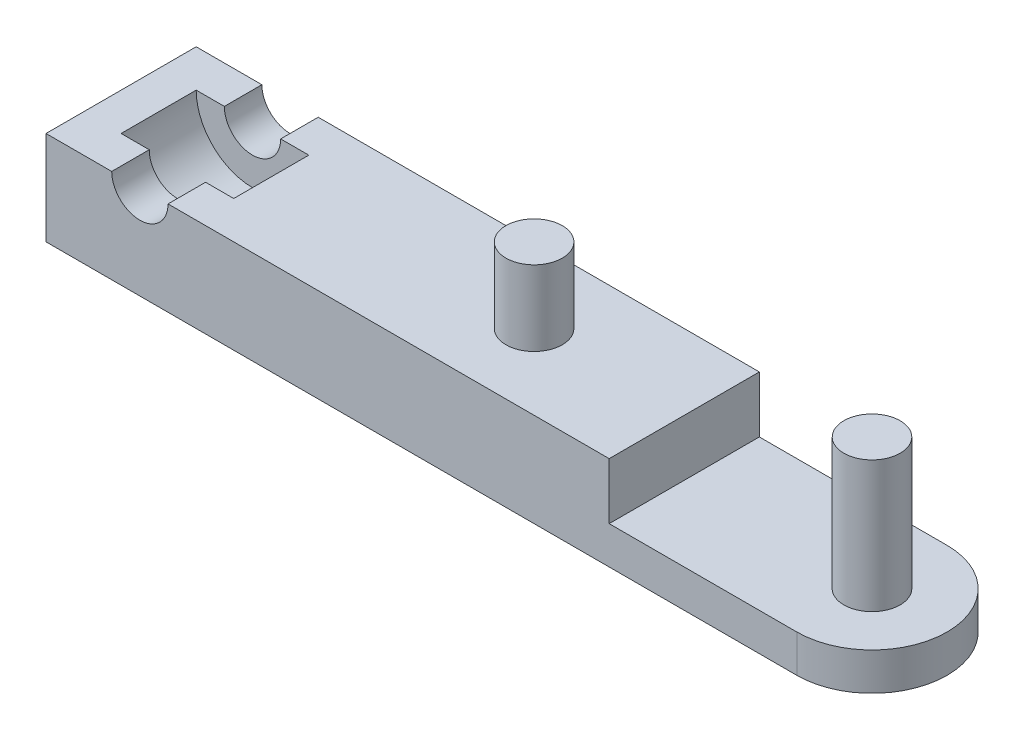
ISO-10303-21;
HEADER;
FILE_DESCRIPTION(('STEP AP214'),'2;1');
FILE_NAME('part.step','',(''),(''),'','','');
FILE_SCHEMA(('AUTOMOTIVE_DESIGN { 1 0 10303 214 1 1 1 1 }'));
ENDSEC;
DATA;
#1=APPLICATION_CONTEXT('core data for automotive mechanical design processes');
#2=APPLICATION_PROTOCOL_DEFINITION('international standard','automotive_design',2000,#1);
#3=PRODUCT_CONTEXT('',#1,'mechanical');
#4=PRODUCT('Part','Part','',(#3));
#5=PRODUCT_RELATED_PRODUCT_CATEGORY('part','',(#4));
#6=PRODUCT_DEFINITION_FORMATION('','',#4);
#7=PRODUCT_DEFINITION_CONTEXT('part definition',#1,'design');
#8=PRODUCT_DEFINITION('design','',#6,#7);
#9=PRODUCT_DEFINITION_SHAPE('','',#8);
#10=(LENGTH_UNIT() NAMED_UNIT(*) SI_UNIT(.MILLI.,.METRE.));
#11=(NAMED_UNIT(*) PLANE_ANGLE_UNIT() SI_UNIT($,.RADIAN.));
#12=(NAMED_UNIT(*) SI_UNIT($,.STERADIAN.) SOLID_ANGLE_UNIT());
#13=UNCERTAINTY_MEASURE_WITH_UNIT(LENGTH_MEASURE(1.E-05),#10,'distance_accuracy_value','');
#14=(GEOMETRIC_REPRESENTATION_CONTEXT(3) GLOBAL_UNCERTAINTY_ASSIGNED_CONTEXT((#13)) GLOBAL_UNIT_ASSIGNED_CONTEXT((#10,
#11,#12)) REPRESENTATION_CONTEXT('',''));
#15=CARTESIAN_POINT('',(0.,0.,0.));
#16=DIRECTION('',(0.,0.,1.));
#17=DIRECTION('',(1.,0.,0.));
#18=AXIS2_PLACEMENT_3D('',#15,#16,#17);
#19=CARTESIAN_POINT('',(30.,5.,-4.00004999999999));
#20=DIRECTION('',(0.,0.,1.));
#21=DIRECTION('',(1.,0.,0.));
#22=AXIS2_PLACEMENT_3D('',#19,#20,#21);
#23=CYLINDRICAL_SURFACE('',#22,1.5);
#24=CARTESIAN_POINT('',(30.,5.,-2.));
#25=DIRECTION('',(0.,0.,1.));
#26=DIRECTION('',(1.,0.,0.));
#27=AXIS2_PLACEMENT_3D('',#24,#25,#26);
#28=CIRCLE('',#27,1.5);
#29=CARTESIAN_POINT('',(31.5,5.,-2.));
#30=VERTEX_POINT('',#29);
#31=CARTESIAN_POINT('',(28.5,5.,-2.));
#32=VERTEX_POINT('',#31);
#33=EDGE_CURVE('E43',#30,#32,#28,.F.);
#34=ORIENTED_EDGE('',*,*,#33,.F.);
#35=DIRECTION('',(0.,0.,1.));
#36=VECTOR('',#35,1.);
#37=CARTESIAN_POINT('',(31.5,5.,-4.00004999999999));
#38=LINE('',#37,#36);
#39=CARTESIAN_POINT('',(31.5,5.,-3.99999999999999));
#40=VERTEX_POINT('',#39);
#41=EDGE_CURVE('E57',#40,#30,#38,.T.);
#42=ORIENTED_EDGE('',*,*,#41,.F.);
#43=CARTESIAN_POINT('',(30.,5.,-4.));
#44=DIRECTION('',(0.,0.,1.));
#45=DIRECTION('',(1.,0.,0.));
#46=AXIS2_PLACEMENT_3D('',#43,#44,#45);
#47=CIRCLE('',#46,1.5);
#48=CARTESIAN_POINT('',(28.5,5.,-4.));
#49=VERTEX_POINT('',#48);
#50=EDGE_CURVE('E206',#49,#40,#47,.T.);
#51=ORIENTED_EDGE('',*,*,#50,.F.);
#52=DIRECTION('',(0.,0.,1.));
#53=VECTOR('',#52,1.);
#54=CARTESIAN_POINT('',(28.5,5.,-4.00004999999999));
#55=LINE('',#54,#53);
#56=EDGE_CURVE('E154',#49,#32,#55,.T.);
#57=ORIENTED_EDGE('',*,*,#56,.T.);
#58=EDGE_LOOP('',(#34,#42,#51,#57));
#59=FACE_BOUND('',#58,.T.);
#60=ADVANCED_FACE('F35',(#59),#23,.F.);
#61=CARTESIAN_POINT('',(0.,5.,0.));
#62=DIRECTION('',(0.,1.,0.));
#63=DIRECTION('',(0.,0.,1.));
#64=AXIS2_PLACEMENT_3D('',#61,#62,#63);
#65=PLANE('',#64);
#66=DIRECTION('',(-1.,0.,0.));
#67=VECTOR('',#66,1.);
#68=CARTESIAN_POINT('',(27.,5.,2.));
#69=LINE('',#68,#67);
#70=CARTESIAN_POINT('',(28.5,5.,2.));
#71=VERTEX_POINT('',#70);
#72=CARTESIAN_POINT('',(27.,5.,2.));
#73=VERTEX_POINT('',#72);
#74=EDGE_CURVE('E145',#71,#73,#69,.T.);
#75=ORIENTED_EDGE('',*,*,#74,.T.);
#76=DIRECTION('',(0.,0.,-1.));
#77=VECTOR('',#76,1.);
#78=CARTESIAN_POINT('',(27.,5.,2.));
#79=LINE('',#78,#77);
#80=CARTESIAN_POINT('',(27.,5.,-2.));
#81=VERTEX_POINT('',#80);
#82=EDGE_CURVE('E135',#73,#81,#79,.T.);
#83=ORIENTED_EDGE('',*,*,#82,.T.);
#84=DIRECTION('',(-1.,0.,0.));
#85=VECTOR('',#84,1.);
#86=CARTESIAN_POINT('',(27.,5.,-2.));
#87=LINE('',#86,#85);
#88=EDGE_CURVE('E139',#32,#81,#87,.T.);
#89=ORIENTED_EDGE('',*,*,#88,.F.);
#90=ORIENTED_EDGE('',*,*,#56,.F.);
#91=DIRECTION('',(-1.,0.,0.));
#92=VECTOR('',#91,1.);
#93=CARTESIAN_POINT('',(25.,5.,-3.99999999999999));
#94=LINE('',#93,#92);
#95=CARTESIAN_POINT('',(25.,5.,-3.99999999999999));
#96=VERTEX_POINT('',#95);
#97=EDGE_CURVE('E181',#49,#96,#94,.T.);
#98=ORIENTED_EDGE('',*,*,#97,.T.);
#99=DIRECTION('',(0.,0.,1.));
#100=VECTOR('',#99,1.);
#101=CARTESIAN_POINT('',(25.,5.,-3.99999999999999));
#102=LINE('',#101,#100);
#103=CARTESIAN_POINT('',(25.,5.,4.));
#104=VERTEX_POINT('',#103);
#105=EDGE_CURVE('E172',#96,#104,#102,.T.);
#106=ORIENTED_EDGE('',*,*,#105,.T.);
#107=DIRECTION('',(1.,0.,0.));
#108=VECTOR('',#107,1.);
#109=CARTESIAN_POINT('',(25.,5.,4.));
#110=LINE('',#109,#108);
#111=CARTESIAN_POINT('',(28.5,5.,4.));
#112=VERTEX_POINT('',#111);
#113=EDGE_CURVE('E176',#104,#112,#110,.T.);
#114=ORIENTED_EDGE('',*,*,#113,.T.);
#115=EDGE_CURVE('E158',#71,#112,#55,.T.);
#116=ORIENTED_EDGE('',*,*,#115,.F.);
#117=EDGE_LOOP('',(#75,#83,#89,#90,#98,#106,#114,#116));
#118=FACE_BOUND('',#117,.T.);
#119=ADVANCED_FACE('F211',(#118),#65,.T.);
#120=CARTESIAN_POINT('',(33.,5.,2.));
#121=VERTEX_POINT('',#120);
#122=CARTESIAN_POINT('',(31.5,5.,2.));
#123=VERTEX_POINT('',#122);
#124=EDGE_CURVE('E148',#121,#123,#69,.T.);
#125=ORIENTED_EDGE('',*,*,#124,.T.);
#126=CARTESIAN_POINT('',(31.5,5.,4.));
#127=VERTEX_POINT('',#126);
#128=EDGE_CURVE('E153',#123,#127,#38,.T.);
#129=ORIENTED_EDGE('',*,*,#128,.T.);
#130=CARTESIAN_POINT('',(55.,5.,4.));
#131=VERTEX_POINT('',#130);
#132=EDGE_CURVE('E175',#127,#131,#110,.T.);
#133=ORIENTED_EDGE('',*,*,#132,.T.);
#134=DIRECTION('',(0.,0.,-1.));
#135=VECTOR('',#134,1.);
#136=CARTESIAN_POINT('',(55.,5.,-3.99999999999999));
#137=LINE('',#136,#135);
#138=CARTESIAN_POINT('',(55.,5.,-3.99999999999999));
#139=VERTEX_POINT('',#138);
#140=EDGE_CURVE('E179',#131,#139,#137,.T.);
#141=ORIENTED_EDGE('',*,*,#140,.T.);
#142=EDGE_CURVE('E182',#139,#40,#94,.T.);
#143=ORIENTED_EDGE('',*,*,#142,.T.);
#144=ORIENTED_EDGE('',*,*,#41,.T.);
#145=CARTESIAN_POINT('',(33.,5.,-2.));
#146=VERTEX_POINT('',#145);
#147=EDGE_CURVE('E50',#146,#30,#87,.T.);
#148=ORIENTED_EDGE('',*,*,#147,.F.);
#149=DIRECTION('',(0.,0.,-1.));
#150=VECTOR('',#149,1.);
#151=CARTESIAN_POINT('',(33.,5.,2.));
#152=LINE('',#151,#150);
#153=EDGE_CURVE('E126',#121,#146,#152,.T.);
#154=ORIENTED_EDGE('',*,*,#153,.F.);
#155=EDGE_LOOP('',(#125,#129,#133,#141,#143,#144,#148,#154));
#156=FACE_BOUND('',#155,.T.);
#157=CARTESIAN_POINT('',(47.,5.,0.));
#158=DIRECTION('',(0.,1.,0.));
#159=DIRECTION('',(0.,0.,1.));
#160=AXIS2_PLACEMENT_3D('',#157,#158,#159);
#161=CIRCLE('',#160,1.5);
#162=CARTESIAN_POINT('',(47.,5.,1.5));
#163=VERTEX_POINT('',#162);
#164=EDGE_CURVE('E157',#163,#163,#161,.T.);
#165=ORIENTED_EDGE('',*,*,#164,.F.);
#166=EDGE_LOOP('',(#165));
#167=FACE_BOUND('',#166,.T.);
#168=ADVANCED_FACE('F141',(#156,#167),#65,.T.);
#169=CARTESIAN_POINT('',(65.,2.,0.));
#170=DIRECTION('',(0.,1.,0.));
#171=DIRECTION('',(0.,0.,1.));
#172=AXIS2_PLACEMENT_3D('',#169,#170,#171);
#173=PLANE('',#172);
#174=DIRECTION('',(0.,0.,-1.));
#175=VECTOR('',#174,1.);
#176=CARTESIAN_POINT('',(55.,2.,-3.99999999999999));
#177=LINE('',#176,#175);
#178=CARTESIAN_POINT('',(55.,2.,4.));
#179=VERTEX_POINT('',#178);
#180=CARTESIAN_POINT('',(55.,2.,-3.99999999999999));
#181=VERTEX_POINT('',#180);
#182=EDGE_CURVE('E169',#179,#181,#177,.T.);
#183=ORIENTED_EDGE('',*,*,#182,.F.);
#184=DIRECTION('',(1.,0.,0.));
#185=VECTOR('',#184,1.);
#186=CARTESIAN_POINT('',(25.,2.,4.));
#187=LINE('',#186,#185);
#188=CARTESIAN_POINT('',(65.,2.,4.));
#189=VERTEX_POINT('',#188);
#190=EDGE_CURVE('E233',#179,#189,#187,.T.);
#191=ORIENTED_EDGE('',*,*,#190,.T.);
#192=CARTESIAN_POINT('',(65.,2.,0.));
#193=DIRECTION('',(0.,1.,0.));
#194=DIRECTION('',(0.,0.,1.));
#195=AXIS2_PLACEMENT_3D('',#192,#193,#194);
#196=CIRCLE('',#195,4.);
#197=CARTESIAN_POINT('',(65.,2.,-4.));
#198=VERTEX_POINT('',#197);
#199=EDGE_CURVE('E230',#189,#198,#196,.T.);
#200=ORIENTED_EDGE('',*,*,#199,.T.);
#201=DIRECTION('',(-1.,0.,0.));
#202=VECTOR('',#201,1.);
#203=CARTESIAN_POINT('',(65.,2.,-4.));
#204=LINE('',#203,#202);
#205=EDGE_CURVE('E193',#198,#181,#204,.T.);
#206=ORIENTED_EDGE('',*,*,#205,.T.);
#207=EDGE_LOOP('',(#183,#191,#200,#206));
#208=FACE_BOUND('',#207,.T.);
#209=CARTESIAN_POINT('',(65.,2.,0.));
#210=DIRECTION('',(0.,1.,0.));
#211=DIRECTION('',(0.,0.,1.));
#212=AXIS2_PLACEMENT_3D('',#209,#210,#211);
#213=CIRCLE('',#212,1.5);
#214=CARTESIAN_POINT('',(65.,2.,1.5));
#215=VERTEX_POINT('',#214);
#216=EDGE_CURVE('E163',#215,#215,#213,.T.);
#217=ORIENTED_EDGE('',*,*,#216,.F.);
#218=EDGE_LOOP('',(#217));
#219=FACE_BOUND('',#218,.T.);
#220=ADVANCED_FACE('F264',(#208,#219),#173,.T.);
#221=CARTESIAN_POINT('',(25.,2.,-3.99999999999999));
#222=DIRECTION('',(1.,0.,0.));
#223=DIRECTION('',(0.,0.,-1.));
#224=AXIS2_PLACEMENT_3D('',#221,#222,#223);
#225=PLANE('',#224);
#226=DIRECTION('',(0.,0.,1.));
#227=VECTOR('',#226,1.);
#228=CARTESIAN_POINT('',(25.,0.,-3.99999999999999));
#229=LINE('',#228,#227);
#230=CARTESIAN_POINT('',(25.,0.,-3.99999999999999));
#231=VERTEX_POINT('',#230);
#232=CARTESIAN_POINT('',(25.,0.,4.));
#233=VERTEX_POINT('',#232);
#234=EDGE_CURVE('E203',#231,#233,#229,.T.);
#235=ORIENTED_EDGE('',*,*,#234,.T.);
#236=DIRECTION('',(0.,-1.,0.));
#237=VECTOR('',#236,1.);
#238=CARTESIAN_POINT('',(25.,2.,4.));
#239=LINE('',#238,#237);
#240=EDGE_CURVE('E207',#104,#233,#239,.T.);
#241=ORIENTED_EDGE('',*,*,#240,.F.);
#242=ORIENTED_EDGE('',*,*,#105,.F.);
#243=DIRECTION('',(0.,-1.,0.));
#244=VECTOR('',#243,1.);
#245=CARTESIAN_POINT('',(25.,2.,-3.99999999999999));
#246=LINE('',#245,#244);
#247=EDGE_CURVE('E229',#96,#231,#246,.T.);
#248=ORIENTED_EDGE('',*,*,#247,.T.);
#249=EDGE_LOOP('',(#235,#241,#242,#248));
#250=FACE_BOUND('',#249,.T.);
#251=ADVANCED_FACE('F37',(#250),#225,.F.);
#252=CARTESIAN_POINT('',(25.,2.,4.));
#253=DIRECTION('',(0.,0.,-1.));
#254=DIRECTION('',(-1.,0.,0.));
#255=AXIS2_PLACEMENT_3D('',#252,#253,#254);
#256=PLANE('',#255);
#257=ORIENTED_EDGE('',*,*,#132,.F.);
#258=CARTESIAN_POINT('',(30.,5.,4.));
#259=DIRECTION('',(0.,0.,1.));
#260=DIRECTION('',(-1.,0.,0.));
#261=AXIS2_PLACEMENT_3D('',#258,#259,#260);
#262=CIRCLE('',#261,1.5);
#263=EDGE_CURVE('E134',#112,#127,#262,.T.);
#264=ORIENTED_EDGE('',*,*,#263,.F.);
#265=ORIENTED_EDGE('',*,*,#113,.F.);
#266=ORIENTED_EDGE('',*,*,#240,.T.);
#267=DIRECTION('',(1.,0.,0.));
#268=VECTOR('',#267,1.);
#269=CARTESIAN_POINT('',(25.,0.,4.));
#270=LINE('',#269,#268);
#271=CARTESIAN_POINT('',(65.,0.,4.));
#272=VERTEX_POINT('',#271);
#273=EDGE_CURVE('E240',#233,#272,#270,.T.);
#274=ORIENTED_EDGE('',*,*,#273,.T.);
#275=DIRECTION('',(0.,-1.,0.));
#276=VECTOR('',#275,1.);
#277=CARTESIAN_POINT('',(65.,2.,4.));
#278=LINE('',#277,#276);
#279=EDGE_CURVE('E246',#189,#272,#278,.T.);
#280=ORIENTED_EDGE('',*,*,#279,.F.);
#281=ORIENTED_EDGE('',*,*,#190,.F.);
#282=DIRECTION('',(0.,-1.,0.));
#283=VECTOR('',#282,1.);
#284=CARTESIAN_POINT('',(55.,5.,4.));
#285=LINE('',#284,#283);
#286=EDGE_CURVE('E198',#131,#179,#285,.T.);
#287=ORIENTED_EDGE('',*,*,#286,.F.);
#288=EDGE_LOOP('',(#257,#264,#265,#266,#274,#280,#281,#287));
#289=FACE_BOUND('',#288,.T.);
#290=ADVANCED_FACE('F252',(#289),#256,.F.);
#291=CARTESIAN_POINT('',(65.,2.,0.));
#292=DIRECTION('',(0.,-1.,0.));
#293=DIRECTION('',(0.,0.,-1.));
#294=AXIS2_PLACEMENT_3D('',#291,#292,#293);
#295=CYLINDRICAL_SURFACE('',#294,4.);
#296=CARTESIAN_POINT('',(65.,0.,0.));
#297=DIRECTION('',(0.,1.,0.));
#298=DIRECTION('',(0.,0.,1.));
#299=AXIS2_PLACEMENT_3D('',#296,#297,#298);
#300=CIRCLE('',#299,4.);
#301=CARTESIAN_POINT('',(65.,0.,-4.));
#302=VERTEX_POINT('',#301);
#303=EDGE_CURVE('E242',#272,#302,#300,.T.);
#304=ORIENTED_EDGE('',*,*,#303,.T.);
#305=DIRECTION('',(0.,-1.,0.));
#306=VECTOR('',#305,1.);
#307=CARTESIAN_POINT('',(65.,2.,-4.));
#308=LINE('',#307,#306);
#309=EDGE_CURVE('E226',#198,#302,#308,.T.);
#310=ORIENTED_EDGE('',*,*,#309,.F.);
#311=ORIENTED_EDGE('',*,*,#199,.F.);
#312=ORIENTED_EDGE('',*,*,#279,.T.);
#313=EDGE_LOOP('',(#304,#310,#311,#312));
#314=FACE_BOUND('',#313,.T.);
#315=ADVANCED_FACE('F262',(#314),#295,.T.);
#316=CARTESIAN_POINT('',(65.,2.,-4.));
#317=DIRECTION('',(0.,0.,1.));
#318=DIRECTION('',(1.,0.,0.));
#319=AXIS2_PLACEMENT_3D('',#316,#317,#318);
#320=PLANE('',#319);
#321=ORIENTED_EDGE('',*,*,#97,.F.);
#322=ORIENTED_EDGE('',*,*,#50,.T.);
#323=ORIENTED_EDGE('',*,*,#142,.F.);
#324=DIRECTION('',(0.,-1.,0.));
#325=VECTOR('',#324,1.);
#326=CARTESIAN_POINT('',(55.,5.,-3.99999999999999));
#327=LINE('',#326,#325);
#328=EDGE_CURVE('E184',#139,#181,#327,.T.);
#329=ORIENTED_EDGE('',*,*,#328,.T.);
#330=ORIENTED_EDGE('',*,*,#205,.F.);
#331=ORIENTED_EDGE('',*,*,#309,.T.);
#332=DIRECTION('',(-1.,0.,0.));
#333=VECTOR('',#332,1.);
#334=CARTESIAN_POINT('',(65.,0.,-4.));
#335=LINE('',#334,#333);
#336=EDGE_CURVE('E235',#302,#231,#335,.T.);
#337=ORIENTED_EDGE('',*,*,#336,.T.);
#338=ORIENTED_EDGE('',*,*,#247,.F.);
#339=EDGE_LOOP('',(#321,#322,#323,#329,#330,#331,#337,#338));
#340=FACE_BOUND('',#339,.T.);
#341=ADVANCED_FACE('F215',(#340),#320,.F.);
#342=CARTESIAN_POINT('',(65.,0.,0.));
#343=DIRECTION('',(0.,1.,0.));
#344=DIRECTION('',(0.,0.,1.));
#345=AXIS2_PLACEMENT_3D('',#342,#343,#344);
#346=PLANE('',#345);
#347=ORIENTED_EDGE('',*,*,#234,.F.);
#348=ORIENTED_EDGE('',*,*,#336,.F.);
#349=ORIENTED_EDGE('',*,*,#303,.F.);
#350=ORIENTED_EDGE('',*,*,#273,.F.);
#351=EDGE_LOOP('',(#347,#348,#349,#350));
#352=FACE_BOUND('',#351,.T.);
#353=ADVANCED_FACE('F259',(#352),#346,.F.);
#354=CARTESIAN_POINT('',(55.,5.,-3.99999999999999));
#355=DIRECTION('',(-1.,0.,0.));
#356=DIRECTION('',(0.,0.,1.));
#357=AXIS2_PLACEMENT_3D('',#354,#355,#356);
#358=PLANE('',#357);
#359=ORIENTED_EDGE('',*,*,#182,.T.);
#360=ORIENTED_EDGE('',*,*,#328,.F.);
#361=ORIENTED_EDGE('',*,*,#140,.F.);
#362=ORIENTED_EDGE('',*,*,#286,.T.);
#363=EDGE_LOOP('',(#359,#360,#361,#362));
#364=FACE_BOUND('',#363,.T.);
#365=ADVANCED_FACE('F222',(#364),#358,.F.);
#366=CARTESIAN_POINT('',(65.,9.,0.));
#367=DIRECTION('',(0.,-1.,0.));
#368=DIRECTION('',(0.,0.,-1.));
#369=AXIS2_PLACEMENT_3D('',#366,#367,#368);
#370=CYLINDRICAL_SURFACE('',#369,1.5);
#371=CARTESIAN_POINT('',(65.,9.,0.));
#372=DIRECTION('',(0.,1.,0.));
#373=DIRECTION('',(0.,0.,1.));
#374=AXIS2_PLACEMENT_3D('',#371,#372,#373);
#375=CIRCLE('',#374,1.5);
#376=CARTESIAN_POINT('',(65.,9.,1.5));
#377=VERTEX_POINT('',#376);
#378=EDGE_CURVE('E166',#377,#377,#375,.T.);
#379=ORIENTED_EDGE('',*,*,#378,.F.);
#380=EDGE_LOOP('',(#379));
#381=FACE_BOUND('',#380,.T.);
#382=ORIENTED_EDGE('',*,*,#216,.T.);
#383=EDGE_LOOP('',(#382));
#384=FACE_BOUND('',#383,.T.);
#385=ADVANCED_FACE('F270',(#381,#384),#370,.T.);
#386=CARTESIAN_POINT('',(65.,9.,0.));
#387=DIRECTION('',(0.,1.,0.));
#388=DIRECTION('',(0.,0.,1.));
#389=AXIS2_PLACEMENT_3D('',#386,#387,#388);
#390=PLANE('',#389);
#391=ORIENTED_EDGE('',*,*,#378,.T.);
#392=EDGE_LOOP('',(#391));
#393=FACE_BOUND('',#392,.T.);
#394=ADVANCED_FACE('F272',(#393),#390,.T.);
#395=CARTESIAN_POINT('',(47.,9.,0.));
#396=DIRECTION('',(0.,-1.,0.));
#397=DIRECTION('',(0.,0.,-1.));
#398=AXIS2_PLACEMENT_3D('',#395,#396,#397);
#399=CYLINDRICAL_SURFACE('',#398,1.5);
#400=CARTESIAN_POINT('',(47.,9.,0.));
#401=DIRECTION('',(0.,1.,0.));
#402=DIRECTION('',(0.,0.,1.));
#403=AXIS2_PLACEMENT_3D('',#400,#401,#402);
#404=CIRCLE('',#403,1.5);
#405=CARTESIAN_POINT('',(47.,9.,1.5));
#406=VERTEX_POINT('',#405);
#407=EDGE_CURVE('E160',#406,#406,#404,.T.);
#408=ORIENTED_EDGE('',*,*,#407,.F.);
#409=EDGE_LOOP('',(#408));
#410=FACE_BOUND('',#409,.T.);
#411=ORIENTED_EDGE('',*,*,#164,.T.);
#412=EDGE_LOOP('',(#411));
#413=FACE_BOUND('',#412,.T.);
#414=ADVANCED_FACE('F279',(#410,#413),#399,.T.);
#415=CARTESIAN_POINT('',(47.,9.,0.));
#416=DIRECTION('',(0.,1.,0.));
#417=DIRECTION('',(0.,0.,1.));
#418=AXIS2_PLACEMENT_3D('',#415,#416,#417);
#419=PLANE('',#418);
#420=ORIENTED_EDGE('',*,*,#407,.T.);
#421=EDGE_LOOP('',(#420));
#422=FACE_BOUND('',#421,.T.);
#423=ADVANCED_FACE('F295',(#422),#419,.T.);
#424=ORIENTED_EDGE('',*,*,#128,.F.);
#425=CARTESIAN_POINT('',(30.,5.,2.));
#426=DIRECTION('',(0.,0.,1.));
#427=DIRECTION('',(1.,0.,0.));
#428=AXIS2_PLACEMENT_3D('',#425,#426,#427);
#429=CIRCLE('',#428,1.5);
#430=EDGE_CURVE('E11',#123,#71,#429,.F.);
#431=ORIENTED_EDGE('',*,*,#430,.T.);
#432=ORIENTED_EDGE('',*,*,#115,.T.);
#433=ORIENTED_EDGE('',*,*,#263,.T.);
#434=EDGE_LOOP('',(#424,#431,#432,#433));
#435=FACE_BOUND('',#434,.T.);
#436=ADVANCED_FACE('F287',(#435),#23,.F.);
#437=CARTESIAN_POINT('',(30.,5.,2.));
#438=DIRECTION('',(0.,0.,1.));
#439=DIRECTION('',(1.,0.,0.));
#440=AXIS2_PLACEMENT_3D('',#437,#438,#439);
#441=PLANE('',#440);
#442=ORIENTED_EDGE('',*,*,#124,.F.);
#443=CARTESIAN_POINT('',(30.,5.,2.));
#444=DIRECTION('',(0.,0.,1.));
#445=DIRECTION('',(1.,0.,0.));
#446=AXIS2_PLACEMENT_3D('',#443,#444,#445);
#447=CIRCLE('',#446,3.);
#448=EDGE_CURVE('E131',#73,#121,#447,.T.);
#449=ORIENTED_EDGE('',*,*,#448,.F.);
#450=ORIENTED_EDGE('',*,*,#74,.F.);
#451=ORIENTED_EDGE('',*,*,#430,.F.);
#452=EDGE_LOOP('',(#442,#449,#450,#451));
#453=FACE_BOUND('',#452,.T.);
#454=ADVANCED_FACE('F294',(#453),#441,.F.);
#455=CARTESIAN_POINT('',(30.,5.,-2.));
#456=DIRECTION('',(0.,0.,1.));
#457=DIRECTION('',(1.,0.,0.));
#458=AXIS2_PLACEMENT_3D('',#455,#456,#457);
#459=PLANE('',#458);
#460=ORIENTED_EDGE('',*,*,#33,.T.);
#461=ORIENTED_EDGE('',*,*,#88,.T.);
#462=CARTESIAN_POINT('',(30.,5.,-2.));
#463=DIRECTION('',(0.,0.,1.));
#464=DIRECTION('',(1.,0.,0.));
#465=AXIS2_PLACEMENT_3D('',#462,#463,#464);
#466=CIRCLE('',#465,3.);
#467=EDGE_CURVE('E128',#81,#146,#466,.T.);
#468=ORIENTED_EDGE('',*,*,#467,.T.);
#469=ORIENTED_EDGE('',*,*,#147,.T.);
#470=EDGE_LOOP('',(#460,#461,#468,#469));
#471=FACE_BOUND('',#470,.T.);
#472=ADVANCED_FACE('F137',(#471),#459,.T.);
#473=CARTESIAN_POINT('',(30.,5.,2.));
#474=DIRECTION('',(0.,0.,-1.));
#475=DIRECTION('',(-1.,0.,0.));
#476=AXIS2_PLACEMENT_3D('',#473,#474,#475);
#477=CYLINDRICAL_SURFACE('',#476,3.);
#478=ORIENTED_EDGE('',*,*,#82,.F.);
#479=ORIENTED_EDGE('',*,*,#448,.T.);
#480=ORIENTED_EDGE('',*,*,#153,.T.);
#481=ORIENTED_EDGE('',*,*,#467,.F.);
#482=EDGE_LOOP('',(#478,#479,#480,#481));
#483=FACE_BOUND('',#482,.T.);
#484=ADVANCED_FACE('F127',(#483),#477,.F.);
#485=CLOSED_SHELL('',(#60,#119,#168,#220,#251,#290,#315,#341,#353,#365,#385,#394,#414,#423,#436,
#454,#472,#484));
#486=MANIFOLD_SOLID_BREP('B2',#485);
#487=ADVANCED_BREP_SHAPE_REPRESENTATION('',(#18,#486),#14);
#488=SHAPE_DEFINITION_REPRESENTATION(#9,#487);
ENDSEC;
END-ISO-10303-21;
